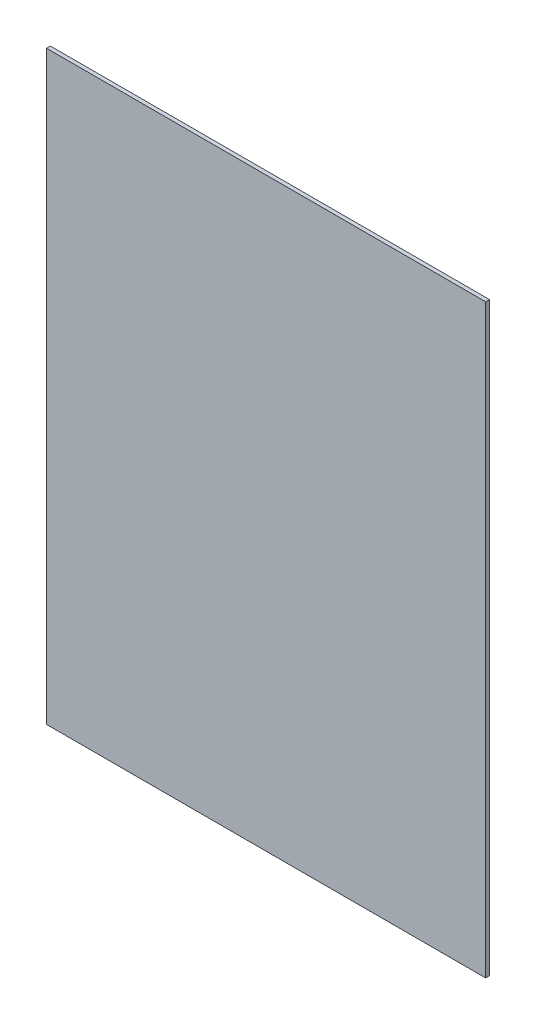
ISO-10303-21;
HEADER;
FILE_DESCRIPTION(('STEP AP214'),'2;1');
FILE_NAME('part.step','',(''),(''),'','','');
FILE_SCHEMA(('AUTOMOTIVE_DESIGN { 1 0 10303 214 1 1 1 1 }'));
ENDSEC;
DATA;
#1=APPLICATION_CONTEXT('core data for automotive mechanical design processes');
#2=APPLICATION_PROTOCOL_DEFINITION('international standard','automotive_design',2000,#1);
#3=PRODUCT_CONTEXT('',#1,'mechanical');
#4=PRODUCT('Part','Part','',(#3));
#5=PRODUCT_RELATED_PRODUCT_CATEGORY('part','',(#4));
#6=PRODUCT_DEFINITION_FORMATION('','',#4);
#7=PRODUCT_DEFINITION_CONTEXT('part definition',#1,'design');
#8=PRODUCT_DEFINITION('design','',#6,#7);
#9=PRODUCT_DEFINITION_SHAPE('','',#8);
#10=(LENGTH_UNIT() NAMED_UNIT(*) SI_UNIT(.MILLI.,.METRE.));
#11=(NAMED_UNIT(*) PLANE_ANGLE_UNIT() SI_UNIT($,.RADIAN.));
#12=(NAMED_UNIT(*) SI_UNIT($,.STERADIAN.) SOLID_ANGLE_UNIT());
#13=UNCERTAINTY_MEASURE_WITH_UNIT(LENGTH_MEASURE(1.E-05),#10,'distance_accuracy_value','');
#14=(GEOMETRIC_REPRESENTATION_CONTEXT(3) GLOBAL_UNCERTAINTY_ASSIGNED_CONTEXT((#13)) GLOBAL_UNIT_ASSIGNED_CONTEXT((#10,
#11,#12)) REPRESENTATION_CONTEXT('',''));
#15=CARTESIAN_POINT('',(0.,0.,0.));
#16=DIRECTION('',(0.,0.,1.));
#17=DIRECTION('',(1.,0.,0.));
#18=AXIS2_PLACEMENT_3D('',#15,#16,#17);
#19=CARTESIAN_POINT('',(750.,1000.,13.));
#20=DIRECTION('',(-1.,0.,0.));
#21=DIRECTION('',(0.,-1.,0.));
#22=AXIS2_PLACEMENT_3D('',#19,#20,#21);
#23=PLANE('',#22);
#24=DIRECTION('',(0.,1.,0.));
#25=VECTOR('',#24,1.);
#26=CARTESIAN_POINT('',(750.,1000.,0.));
#27=LINE('',#26,#25);
#28=CARTESIAN_POINT('',(750.,-1000.,0.));
#29=VERTEX_POINT('',#28);
#30=CARTESIAN_POINT('',(750.,1000.,0.));
#31=VERTEX_POINT('',#30);
#32=EDGE_CURVE('E99',#29,#31,#27,.T.);
#33=ORIENTED_EDGE('',*,*,#32,.T.);
#34=DIRECTION('',(0.,0.,-1.));
#35=VECTOR('',#34,1.);
#36=CARTESIAN_POINT('',(750.,1000.,13.));
#37=LINE('',#36,#35);
#38=CARTESIAN_POINT('',(750.,1000.,13.));
#39=VERTEX_POINT('',#38);
#40=EDGE_CURVE('E11',#39,#31,#37,.T.);
#41=ORIENTED_EDGE('',*,*,#40,.F.);
#42=DIRECTION('',(0.,1.,0.));
#43=VECTOR('',#42,1.);
#44=CARTESIAN_POINT('',(750.,1000.,13.));
#45=LINE('',#44,#43);
#46=CARTESIAN_POINT('',(750.,-1000.,13.));
#47=VERTEX_POINT('',#46);
#48=EDGE_CURVE('E87',#47,#39,#45,.T.);
#49=ORIENTED_EDGE('',*,*,#48,.F.);
#50=DIRECTION('',(0.,0.,-1.));
#51=VECTOR('',#50,1.);
#52=CARTESIAN_POINT('',(750.,-1000.,13.));
#53=LINE('',#52,#51);
#54=EDGE_CURVE('E95',#47,#29,#53,.T.);
#55=ORIENTED_EDGE('',*,*,#54,.T.);
#56=EDGE_LOOP('',(#33,#41,#49,#55));
#57=FACE_BOUND('',#56,.T.);
#58=ADVANCED_FACE('F36',(#57),#23,.F.);
#59=CARTESIAN_POINT('',(-750.,1000.,13.));
#60=DIRECTION('',(0.,-1.,0.));
#61=DIRECTION('',(0.,0.,-1.));
#62=AXIS2_PLACEMENT_3D('',#59,#60,#61);
#63=PLANE('',#62);
#64=DIRECTION('',(-1.,0.,0.));
#65=VECTOR('',#64,1.);
#66=CARTESIAN_POINT('',(-750.,1000.,0.));
#67=LINE('',#66,#65);
#68=CARTESIAN_POINT('',(-750.,1000.,0.));
#69=VERTEX_POINT('',#68);
#70=EDGE_CURVE('E91',#31,#69,#67,.T.);
#71=ORIENTED_EDGE('',*,*,#70,.T.);
#72=DIRECTION('',(0.,0.,-1.));
#73=VECTOR('',#72,1.);
#74=CARTESIAN_POINT('',(-750.,1000.,13.));
#75=LINE('',#74,#73);
#76=CARTESIAN_POINT('',(-750.,1000.,13.));
#77=VERTEX_POINT('',#76);
#78=EDGE_CURVE('E44',#77,#69,#75,.T.);
#79=ORIENTED_EDGE('',*,*,#78,.F.);
#80=DIRECTION('',(-1.,0.,0.));
#81=VECTOR('',#80,1.);
#82=CARTESIAN_POINT('',(-750.,1000.,13.));
#83=LINE('',#82,#81);
#84=EDGE_CURVE('E82',#39,#77,#83,.T.);
#85=ORIENTED_EDGE('',*,*,#84,.F.);
#86=ORIENTED_EDGE('',*,*,#40,.T.);
#87=EDGE_LOOP('',(#71,#79,#85,#86));
#88=FACE_BOUND('',#87,.T.);
#89=ADVANCED_FACE('F90',(#88),#63,.F.);
#90=CARTESIAN_POINT('',(-750.,1000.,13.));
#91=DIRECTION('',(1.,0.,0.));
#92=DIRECTION('',(0.,1.,0.));
#93=AXIS2_PLACEMENT_3D('',#90,#91,#92);
#94=PLANE('',#93);
#95=DIRECTION('',(0.,-1.,0.));
#96=VECTOR('',#95,1.);
#97=CARTESIAN_POINT('',(-750.,1000.,0.));
#98=LINE('',#97,#96);
#99=CARTESIAN_POINT('',(-750.,-1000.,0.));
#100=VERTEX_POINT('',#99);
#101=EDGE_CURVE('E69',#69,#100,#98,.T.);
#102=ORIENTED_EDGE('',*,*,#101,.T.);
#103=DIRECTION('',(0.,0.,-1.));
#104=VECTOR('',#103,1.);
#105=CARTESIAN_POINT('',(-750.,-1000.,13.));
#106=LINE('',#105,#104);
#107=CARTESIAN_POINT('',(-750.,-1000.,13.));
#108=VERTEX_POINT('',#107);
#109=EDGE_CURVE('E92',#108,#100,#106,.T.);
#110=ORIENTED_EDGE('',*,*,#109,.F.);
#111=DIRECTION('',(0.,-1.,0.));
#112=VECTOR('',#111,1.);
#113=CARTESIAN_POINT('',(-750.,1000.,13.));
#114=LINE('',#113,#112);
#115=EDGE_CURVE('E85',#77,#108,#114,.T.);
#116=ORIENTED_EDGE('',*,*,#115,.F.);
#117=ORIENTED_EDGE('',*,*,#78,.T.);
#118=EDGE_LOOP('',(#102,#110,#116,#117));
#119=FACE_BOUND('',#118,.T.);
#120=ADVANCED_FACE('F93',(#119),#94,.F.);
#121=CARTESIAN_POINT('',(-750.,-1000.,13.));
#122=DIRECTION('',(0.,1.,0.));
#123=DIRECTION('',(0.,0.,1.));
#124=AXIS2_PLACEMENT_3D('',#121,#122,#123);
#125=PLANE('',#124);
#126=DIRECTION('',(1.,0.,0.));
#127=VECTOR('',#126,1.);
#128=CARTESIAN_POINT('',(-750.,-1000.,0.));
#129=LINE('',#128,#127);
#130=EDGE_CURVE('E75',#100,#29,#129,.T.);
#131=ORIENTED_EDGE('',*,*,#130,.T.);
#132=ORIENTED_EDGE('',*,*,#54,.F.);
#133=DIRECTION('',(1.,0.,0.));
#134=VECTOR('',#133,1.);
#135=CARTESIAN_POINT('',(-750.,-1000.,13.));
#136=LINE('',#135,#134);
#137=EDGE_CURVE('E52',#108,#47,#136,.T.);
#138=ORIENTED_EDGE('',*,*,#137,.F.);
#139=ORIENTED_EDGE('',*,*,#109,.T.);
#140=EDGE_LOOP('',(#131,#132,#138,#139));
#141=FACE_BOUND('',#140,.T.);
#142=ADVANCED_FACE('F106',(#141),#125,.F.);
#143=CARTESIAN_POINT('',(0.,0.,13.));
#144=DIRECTION('',(0.,0.,1.));
#145=DIRECTION('',(1.,0.,0.));
#146=AXIS2_PLACEMENT_3D('',#143,#144,#145);
#147=PLANE('',#146);
#148=ORIENTED_EDGE('',*,*,#48,.T.);
#149=ORIENTED_EDGE('',*,*,#84,.T.);
#150=ORIENTED_EDGE('',*,*,#115,.T.);
#151=ORIENTED_EDGE('',*,*,#137,.T.);
#152=EDGE_LOOP('',(#148,#149,#150,#151));
#153=FACE_BOUND('',#152,.T.);
#154=ADVANCED_FACE('F83',(#153),#147,.T.);
#155=CARTESIAN_POINT('',(0.,0.,0.));
#156=DIRECTION('',(0.,0.,1.));
#157=DIRECTION('',(1.,0.,0.));
#158=AXIS2_PLACEMENT_3D('',#155,#156,#157);
#159=PLANE('',#158);
#160=ORIENTED_EDGE('',*,*,#32,.F.);
#161=ORIENTED_EDGE('',*,*,#130,.F.);
#162=ORIENTED_EDGE('',*,*,#101,.F.);
#163=ORIENTED_EDGE('',*,*,#70,.F.);
#164=EDGE_LOOP('',(#160,#161,#162,#163));
#165=FACE_BOUND('',#164,.T.);
#166=ADVANCED_FACE('F109',(#165),#159,.F.);
#167=CLOSED_SHELL('',(#58,#89,#120,#142,#154,#166));
#168=MANIFOLD_SOLID_BREP('B2',#167);
#169=ADVANCED_BREP_SHAPE_REPRESENTATION('',(#18,#168),#14);
#170=SHAPE_DEFINITION_REPRESENTATION(#9,#169);
ENDSEC;
END-ISO-10303-21;
